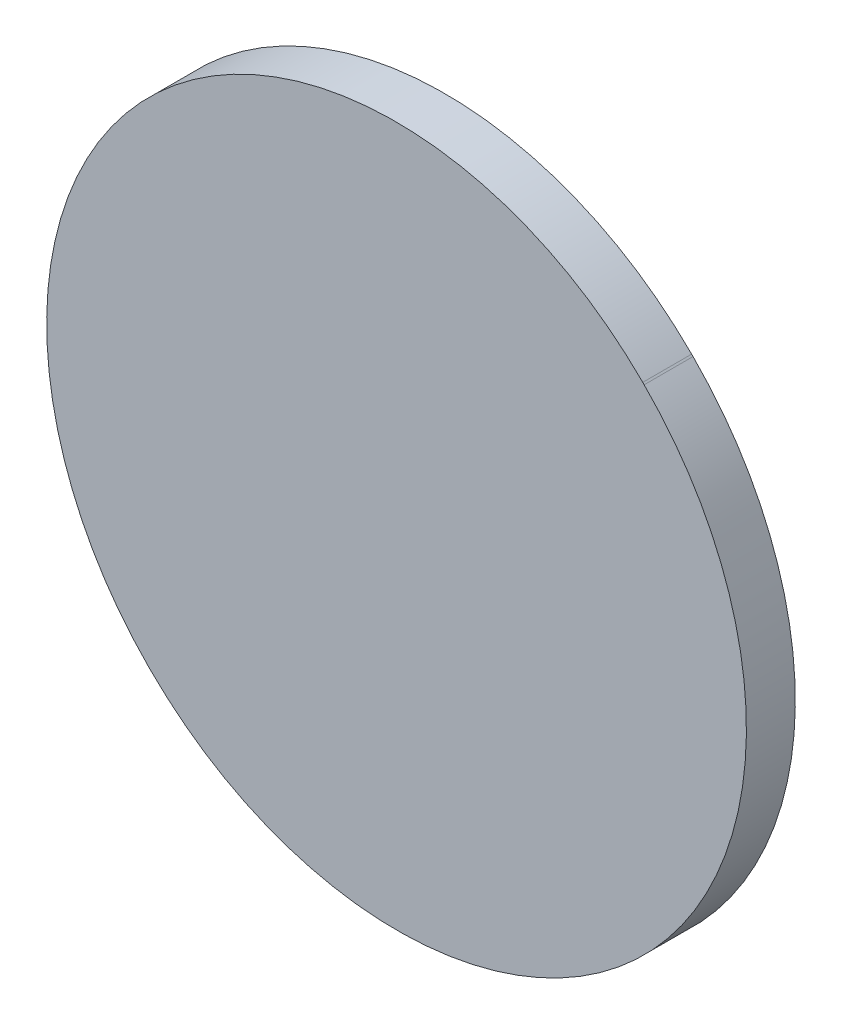
ISO-10303-21;
HEADER;
FILE_DESCRIPTION(('STEP AP214'),'2;1');
FILE_NAME('part.step','',(''),(''),'','','');
FILE_SCHEMA(('AUTOMOTIVE_DESIGN { 1 0 10303 214 1 1 1 1 }'));
ENDSEC;
DATA;
#1=APPLICATION_CONTEXT('core data for automotive mechanical design processes');
#2=APPLICATION_PROTOCOL_DEFINITION('international standard','automotive_design',2000,#1);
#3=PRODUCT_CONTEXT('',#1,'mechanical');
#4=PRODUCT('Part','Part','',(#3));
#5=PRODUCT_RELATED_PRODUCT_CATEGORY('part','',(#4));
#6=PRODUCT_DEFINITION_FORMATION('','',#4);
#7=PRODUCT_DEFINITION_CONTEXT('part definition',#1,'design');
#8=PRODUCT_DEFINITION('design','',#6,#7);
#9=PRODUCT_DEFINITION_SHAPE('','',#8);
#10=(LENGTH_UNIT() NAMED_UNIT(*) SI_UNIT(.MILLI.,.METRE.));
#11=(NAMED_UNIT(*) PLANE_ANGLE_UNIT() SI_UNIT($,.RADIAN.));
#12=(NAMED_UNIT(*) SI_UNIT($,.STERADIAN.) SOLID_ANGLE_UNIT());
#13=UNCERTAINTY_MEASURE_WITH_UNIT(LENGTH_MEASURE(1.E-05),#10,'distance_accuracy_value','');
#14=(GEOMETRIC_REPRESENTATION_CONTEXT(3) GLOBAL_UNCERTAINTY_ASSIGNED_CONTEXT((#13)) GLOBAL_UNIT_ASSIGNED_CONTEXT((#10,
#11,#12)) REPRESENTATION_CONTEXT('',''));
#15=CARTESIAN_POINT('',(0.,0.,0.));
#16=DIRECTION('',(0.,0.,1.));
#17=DIRECTION('',(1.,0.,0.));
#18=AXIS2_PLACEMENT_3D('',#15,#16,#17);
#19=CARTESIAN_POINT('',(128.163223,-112.674776,1.635));
#20=DIRECTION('',(0.,0.,1.));
#21=DIRECTION('',(1.,0.,0.));
#22=AXIS2_PLACEMENT_3D('',#19,#20,#21);
#23=PLANE('',#22);
#24=DIRECTION('',(0.707106781186548,-0.707106781186548,0.));
#25=VECTOR('',#24,1.);
#26=CARTESIAN_POINT('',(128.163223,-112.674776,1.635));
#27=LINE('',#26,#25);
#28=CARTESIAN_POINT('',(128.163223,-112.674776,1.635));
#29=VERTEX_POINT('',#28);
#30=CARTESIAN_POINT('',(128.164223,-112.675776,1.635));
#31=VERTEX_POINT('',#30);
#32=EDGE_CURVE('E91',#29,#31,#27,.T.);
#33=ORIENTED_EDGE('',*,*,#32,.T.);
#34=CARTESIAN_POINT('',(128.3409995,-112.4989995,1.635));
#35=DIRECTION('',(0.,0.,1.));
#36=DIRECTION('',(-0.707106781186548,-0.707106781186548,0.));
#37=AXIS2_PLACEMENT_3D('',#34,#35,#36);
#38=CIRCLE('',#37,0.249999723809);
#39=CARTESIAN_POINT('',(128.517776,-112.322223,1.635));
#40=VERTEX_POINT('',#39);
#41=EDGE_CURVE('E69',#31,#40,#38,.T.);
#42=ORIENTED_EDGE('',*,*,#41,.T.);
#43=DIRECTION('',(-0.707106781191548,0.707106781181548,0.));
#44=VECTOR('',#43,1.);
#45=CARTESIAN_POINT('',(128.517776,-112.322223,1.635));
#46=LINE('',#45,#44);
#47=CARTESIAN_POINT('',(128.516776,-112.321223,1.635));
#48=VERTEX_POINT('',#47);
#49=EDGE_CURVE('E74',#40,#48,#46,.T.);
#50=ORIENTED_EDGE('',*,*,#49,.T.);
#51=CARTESIAN_POINT('',(128.3399995,-112.4979995,1.635));
#52=DIRECTION('',(0.,0.,1.));
#53=DIRECTION('',(0.707106781187048,0.707106781186048,0.));
#54=AXIS2_PLACEMENT_3D('',#51,#52,#53);
#55=CIRCLE('',#54,0.249999723809);
#56=EDGE_CURVE('E11',#48,#29,#55,.T.);
#57=ORIENTED_EDGE('',*,*,#56,.T.);
#58=EDGE_LOOP('',(#33,#42,#50,#57));
#59=FACE_BOUND('',#58,.T.);
#60=ADVANCED_FACE('F17',(#59),#23,.T.);
#61=CARTESIAN_POINT('',(128.163223,-112.674776,1.6));
#62=DIRECTION('',(0.,0.,1.));
#63=DIRECTION('',(1.,0.,0.));
#64=AXIS2_PLACEMENT_3D('',#61,#62,#63);
#65=PLANE('',#64);
#66=CARTESIAN_POINT('',(128.3399995,-112.4979995,1.6));
#67=DIRECTION('',(0.,0.,1.));
#68=DIRECTION('',(0.707106781187048,0.707106781186048,0.));
#69=AXIS2_PLACEMENT_3D('',#66,#67,#68);
#70=CIRCLE('',#69,0.249999723809);
#71=CARTESIAN_POINT('',(128.516776,-112.321223,1.6));
#72=VERTEX_POINT('',#71);
#73=CARTESIAN_POINT('',(128.163223,-112.674776,1.6));
#74=VERTEX_POINT('',#73);
#75=EDGE_CURVE('E26',#72,#74,#70,.T.);
#76=ORIENTED_EDGE('',*,*,#75,.F.);
#77=DIRECTION('',(-0.707106781191548,0.707106781181548,0.));
#78=VECTOR('',#77,1.);
#79=CARTESIAN_POINT('',(128.517776,-112.322223,1.6));
#80=LINE('',#79,#78);
#81=CARTESIAN_POINT('',(128.517776,-112.322223,1.6));
#82=VERTEX_POINT('',#81);
#83=EDGE_CURVE('E56',#82,#72,#80,.T.);
#84=ORIENTED_EDGE('',*,*,#83,.F.);
#85=CARTESIAN_POINT('',(128.3409995,-112.4989995,1.6));
#86=DIRECTION('',(0.,0.,1.));
#87=DIRECTION('',(-0.707106781186548,-0.707106781186548,0.));
#88=AXIS2_PLACEMENT_3D('',#85,#86,#87);
#89=CIRCLE('',#88,0.249999723809);
#90=CARTESIAN_POINT('',(128.164223,-112.675776,1.6));
#91=VERTEX_POINT('',#90);
#92=EDGE_CURVE('E62',#91,#82,#89,.T.);
#93=ORIENTED_EDGE('',*,*,#92,.F.);
#94=DIRECTION('',(0.707106781186548,-0.707106781186548,0.));
#95=VECTOR('',#94,1.);
#96=CARTESIAN_POINT('',(128.163223,-112.674776,1.6));
#97=LINE('',#96,#95);
#98=EDGE_CURVE('E95',#74,#91,#97,.T.);
#99=ORIENTED_EDGE('',*,*,#98,.F.);
#100=EDGE_LOOP('',(#76,#84,#93,#99));
#101=FACE_BOUND('',#100,.T.);
#102=ADVANCED_FACE('F58',(#101),#65,.F.);
#103=CARTESIAN_POINT('',(128.3399995,-112.4979995,1.6));
#104=DIRECTION('',(0.,0.,-1.));
#105=DIRECTION('',(0.707106781187048,0.707106781186048,0.));
#106=AXIS2_PLACEMENT_3D('',#103,#104,#105);
#107=CYLINDRICAL_SURFACE('',#106,0.249999723809);
#108=ORIENTED_EDGE('',*,*,#75,.T.);
#109=DIRECTION('',(0.,0.,1.));
#110=VECTOR('',#109,1.);
#111=CARTESIAN_POINT('',(128.163223,-112.674776,1.6));
#112=LINE('',#111,#110);
#113=EDGE_CURVE('E85',#74,#29,#112,.T.);
#114=ORIENTED_EDGE('',*,*,#113,.T.);
#115=ORIENTED_EDGE('',*,*,#56,.F.);
#116=DIRECTION('',(0.,0.,1.));
#117=VECTOR('',#116,1.);
#118=CARTESIAN_POINT('',(128.516776,-112.321223,1.6));
#119=LINE('',#118,#117);
#120=EDGE_CURVE('E68',#72,#48,#119,.T.);
#121=ORIENTED_EDGE('',*,*,#120,.F.);
#122=EDGE_LOOP('',(#108,#114,#115,#121));
#123=FACE_BOUND('',#122,.T.);
#124=ADVANCED_FACE('F109',(#123),#107,.T.);
#125=CARTESIAN_POINT('',(128.517776,-112.322223,1.6));
#126=DIRECTION('',(-0.707106781181548,-0.707106781191548,0.));
#127=DIRECTION('',(-0.707106781191548,0.707106781181548,0.));
#128=AXIS2_PLACEMENT_3D('',#125,#126,#127);
#129=PLANE('',#128);
#130=ORIENTED_EDGE('',*,*,#83,.T.);
#131=ORIENTED_EDGE('',*,*,#120,.T.);
#132=ORIENTED_EDGE('',*,*,#49,.F.);
#133=DIRECTION('',(0.,0.,1.));
#134=VECTOR('',#133,1.);
#135=CARTESIAN_POINT('',(128.517776,-112.322223,1.6));
#136=LINE('',#135,#134);
#137=EDGE_CURVE('E72',#82,#40,#136,.T.);
#138=ORIENTED_EDGE('',*,*,#137,.F.);
#139=EDGE_LOOP('',(#130,#131,#132,#138));
#140=FACE_BOUND('',#139,.T.);
#141=ADVANCED_FACE('F73',(#140),#129,.F.);
#142=CARTESIAN_POINT('',(128.3409995,-112.4989995,1.6));
#143=DIRECTION('',(0.,0.,-1.));
#144=DIRECTION('',(-0.707106781186548,-0.707106781186548,0.));
#145=AXIS2_PLACEMENT_3D('',#142,#143,#144);
#146=CYLINDRICAL_SURFACE('',#145,0.249999723809);
#147=ORIENTED_EDGE('',*,*,#92,.T.);
#148=ORIENTED_EDGE('',*,*,#137,.T.);
#149=ORIENTED_EDGE('',*,*,#41,.F.);
#150=DIRECTION('',(0.,0.,1.));
#151=VECTOR('',#150,1.);
#152=CARTESIAN_POINT('',(128.164223,-112.675776,1.6));
#153=LINE('',#152,#151);
#154=EDGE_CURVE('E82',#91,#31,#153,.T.);
#155=ORIENTED_EDGE('',*,*,#154,.F.);
#156=EDGE_LOOP('',(#147,#148,#149,#155));
#157=FACE_BOUND('',#156,.T.);
#158=ADVANCED_FACE('F80',(#157),#146,.T.);
#159=CARTESIAN_POINT('',(128.163223,-112.674776,1.6));
#160=DIRECTION('',(0.707106781186548,0.707106781186548,0.));
#161=DIRECTION('',(0.,0.,-1.));
#162=AXIS2_PLACEMENT_3D('',#159,#160,#161);
#163=PLANE('',#162);
#164=ORIENTED_EDGE('',*,*,#98,.T.);
#165=ORIENTED_EDGE('',*,*,#154,.T.);
#166=ORIENTED_EDGE('',*,*,#32,.F.);
#167=ORIENTED_EDGE('',*,*,#113,.F.);
#168=EDGE_LOOP('',(#164,#165,#166,#167));
#169=FACE_BOUND('',#168,.T.);
#170=ADVANCED_FACE('F116',(#169),#163,.F.);
#171=CLOSED_SHELL('',(#60,#102,#124,#141,#158,#170));
#172=MANIFOLD_SOLID_BREP('B1',#171);
#173=ADVANCED_BREP_SHAPE_REPRESENTATION('',(#18,#172),#14);
#174=SHAPE_DEFINITION_REPRESENTATION(#9,#173);
ENDSEC;
END-ISO-10303-21;
